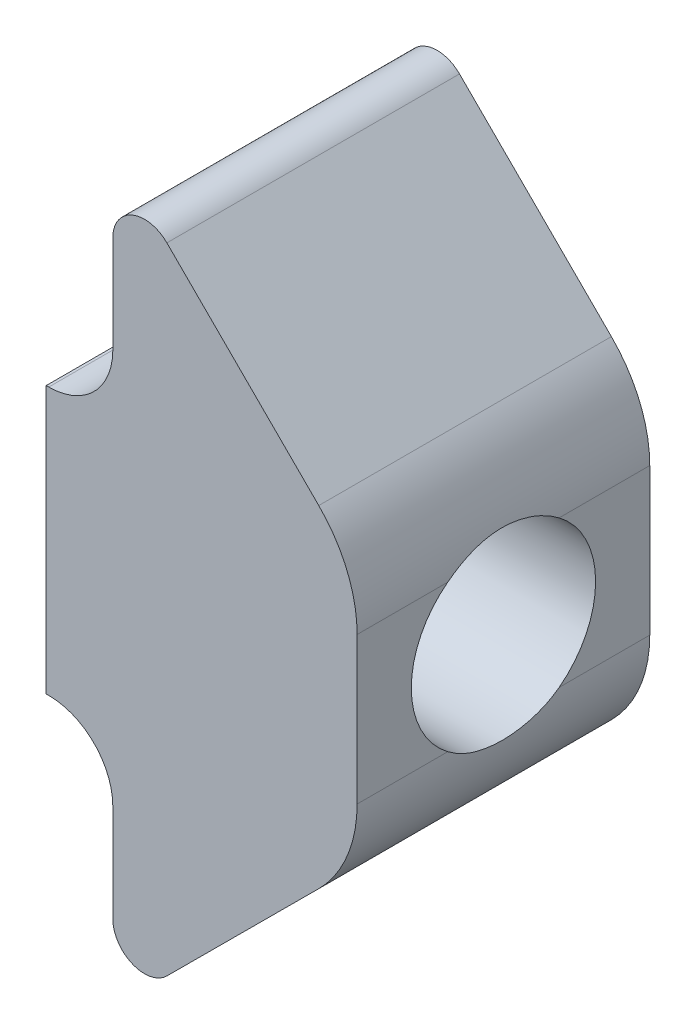
ISO-10303-21;
HEADER;
FILE_DESCRIPTION(('STEP AP214'),'2;1');
FILE_NAME('part.step','',(''),(''),'','','');
FILE_SCHEMA(('AUTOMOTIVE_DESIGN { 1 0 10303 214 1 1 1 1 }'));
ENDSEC;
DATA;
#1=APPLICATION_CONTEXT('core data for automotive mechanical design processes');
#2=APPLICATION_PROTOCOL_DEFINITION('international standard','automotive_design',2000,#1);
#3=PRODUCT_CONTEXT('',#1,'mechanical');
#4=PRODUCT('Part','Part','',(#3));
#5=PRODUCT_RELATED_PRODUCT_CATEGORY('part','',(#4));
#6=PRODUCT_DEFINITION_FORMATION('','',#4);
#7=PRODUCT_DEFINITION_CONTEXT('part definition',#1,'design');
#8=PRODUCT_DEFINITION('design','',#6,#7);
#9=PRODUCT_DEFINITION_SHAPE('','',#8);
#10=(LENGTH_UNIT() NAMED_UNIT(*) SI_UNIT(.MILLI.,.METRE.));
#11=(NAMED_UNIT(*) PLANE_ANGLE_UNIT() SI_UNIT($,.RADIAN.));
#12=(NAMED_UNIT(*) SI_UNIT($,.STERADIAN.) SOLID_ANGLE_UNIT());
#13=UNCERTAINTY_MEASURE_WITH_UNIT(LENGTH_MEASURE(1.E-05),#10,'distance_accuracy_value','');
#14=(GEOMETRIC_REPRESENTATION_CONTEXT(3) GLOBAL_UNCERTAINTY_ASSIGNED_CONTEXT((#13)) GLOBAL_UNIT_ASSIGNED_CONTEXT((#10,
#11,#12)) REPRESENTATION_CONTEXT('',''));
#15=CARTESIAN_POINT('',(0.,0.,0.));
#16=DIRECTION('',(0.,0.,1.));
#17=DIRECTION('',(1.,0.,0.));
#18=AXIS2_PLACEMENT_3D('',#15,#16,#17);
#19=CARTESIAN_POINT('',(-4.84850000000001,1.59318550686057,6.35));
#20=DIRECTION('',(1.,0.,0.));
#21=DIRECTION('',(0.,1.,0.));
#22=AXIS2_PLACEMENT_3D('',#19,#20,#21);
#23=PLANE('',#22);
#24=CARTESIAN_POINT('',(-4.84850000000001,0.,3.175));
#25=DIRECTION('',(1.,0.,0.));
#26=DIRECTION('',(0.,1.,0.));
#27=AXIS2_PLACEMENT_3D('',#24,#25,#26);
#28=CIRCLE('',#27,2.);
#29=CARTESIAN_POINT('',(-4.8485,-1.59318550686057,4.38403264667643));
#30=VERTEX_POINT('',#29);
#31=CARTESIAN_POINT('',(-4.84850000000002,1.59318550686057,4.38403264667644));
#32=VERTEX_POINT('',#31);
#33=EDGE_CURVE('E333',#30,#32,#28,.F.);
#34=ORIENTED_EDGE('',*,*,#33,.T.);
#35=DIRECTION('',(0.,0.,-1.));
#36=VECTOR('',#35,1.);
#37=CARTESIAN_POINT('',(-4.84850000000002,1.59318550686057,6.35));
#38=LINE('',#37,#36);
#39=CARTESIAN_POINT('',(-4.84850000000002,1.59318550686057,6.35));
#40=VERTEX_POINT('',#39);
#41=EDGE_CURVE('E266',#40,#32,#38,.T.);
#42=ORIENTED_EDGE('',*,*,#41,.F.);
#43=DIRECTION('',(0.,-1.,0.));
#44=VECTOR('',#43,1.);
#45=CARTESIAN_POINT('',(-4.84850000000001,1.59318550686057,6.35));
#46=LINE('',#45,#44);
#47=CARTESIAN_POINT('',(-4.8485,-1.59318550686057,6.35));
#48=VERTEX_POINT('',#47);
#49=EDGE_CURVE('E356',#40,#48,#46,.T.);
#50=ORIENTED_EDGE('',*,*,#49,.T.);
#51=DIRECTION('',(0.,0.,-1.));
#52=VECTOR('',#51,1.);
#53=CARTESIAN_POINT('',(-4.8485,-1.59318550686057,6.35));
#54=LINE('',#53,#52);
#55=EDGE_CURVE('E261',#48,#30,#54,.T.);
#56=ORIENTED_EDGE('',*,*,#55,.T.);
#57=EDGE_LOOP('',(#34,#42,#50,#56));
#58=FACE_BOUND('',#57,.T.);
#59=ADVANCED_FACE('F45',(#58),#23,.T.);
#60=CARTESIAN_POINT('',(-11.5392124071298,-2.89845688183043,6.35));
#61=DIRECTION('',(0.,-1.,0.));
#62=DIRECTION('',(1.,0.,0.));
#63=AXIS2_PLACEMENT_3D('',#60,#61,#62);
#64=PLANE('',#63);
#65=DIRECTION('',(-1.,0.,0.));
#66=VECTOR('',#65,1.);
#67=CARTESIAN_POINT('',(-11.5392124071298,-2.89845688183043,0.));
#68=LINE('',#67,#66);
#69=CARTESIAN_POINT('',(-11.5392124071298,-2.89845688183043,0.));
#70=VERTEX_POINT('',#69);
#71=CARTESIAN_POINT('',(-11.5951,-2.89845688183043,0.));
#72=VERTEX_POINT('',#71);
#73=EDGE_CURVE('E197',#70,#72,#68,.T.);
#74=ORIENTED_EDGE('',*,*,#73,.F.);
#75=DIRECTION('',(0.,0.,-1.));
#76=VECTOR('',#75,1.);
#77=CARTESIAN_POINT('',(-11.5392124071298,-2.89845688183043,6.35));
#78=LINE('',#77,#76);
#79=CARTESIAN_POINT('',(-11.5392124071298,-2.89845688183043,6.35));
#80=VERTEX_POINT('',#79);
#81=EDGE_CURVE('E71',#80,#70,#78,.T.);
#82=ORIENTED_EDGE('',*,*,#81,.F.);
#83=DIRECTION('',(-1.,0.,0.));
#84=VECTOR('',#83,1.);
#85=CARTESIAN_POINT('',(-11.5392124071298,-2.89845688183043,6.35));
#86=LINE('',#85,#84);
#87=CARTESIAN_POINT('',(-11.5951,-2.89845688183043,6.35));
#88=VERTEX_POINT('',#87);
#89=EDGE_CURVE('E251',#80,#88,#86,.T.);
#90=ORIENTED_EDGE('',*,*,#89,.T.);
#91=DIRECTION('',(0.,0.,-1.));
#92=VECTOR('',#91,1.);
#93=CARTESIAN_POINT('',(-11.5951,-2.89845688183043,6.35));
#94=LINE('',#93,#92);
#95=EDGE_CURVE('E128',#88,#72,#94,.T.);
#96=ORIENTED_EDGE('',*,*,#95,.T.);
#97=EDGE_LOOP('',(#74,#82,#90,#96));
#98=FACE_BOUND('',#97,.T.);
#99=ADVANCED_FACE('F305',(#98),#64,.T.);
#100=CARTESIAN_POINT('',(-11.5392124071298,-4.28746928896025,6.35));
#101=DIRECTION('',(0.,0.,-1.));
#102=DIRECTION('',(-1.,0.,0.));
#103=AXIS2_PLACEMENT_3D('',#100,#101,#102);
#104=CYLINDRICAL_SURFACE('',#103,1.38901240712982);
#105=CARTESIAN_POINT('',(-11.5392124071298,-4.28746928896025,0.));
#106=DIRECTION('',(0.,0.,1.));
#107=DIRECTION('',(1.,0.,0.));
#108=AXIS2_PLACEMENT_3D('',#105,#106,#107);
#109=CIRCLE('',#108,1.38901240712982);
#110=CARTESIAN_POINT('',(-10.1502,-4.28746928896025,0.));
#111=VERTEX_POINT('',#110);
#112=EDGE_CURVE('E247',#111,#70,#109,.T.);
#113=ORIENTED_EDGE('',*,*,#112,.F.);
#114=DIRECTION('',(0.,0.,-1.));
#115=VECTOR('',#114,1.);
#116=CARTESIAN_POINT('',(-10.1502,-4.28746928896025,6.35));
#117=LINE('',#116,#115);
#118=CARTESIAN_POINT('',(-10.1502,-4.28746928896025,6.35));
#119=VERTEX_POINT('',#118);
#120=EDGE_CURVE('E177',#119,#111,#117,.T.);
#121=ORIENTED_EDGE('',*,*,#120,.F.);
#122=CARTESIAN_POINT('',(-11.5392124071298,-4.28746928896025,6.35));
#123=DIRECTION('',(0.,0.,1.));
#124=DIRECTION('',(1.,0.,0.));
#125=AXIS2_PLACEMENT_3D('',#122,#123,#124);
#126=CIRCLE('',#125,1.38901240712982);
#127=EDGE_CURVE('E190',#119,#80,#126,.T.);
#128=ORIENTED_EDGE('',*,*,#127,.T.);
#129=ORIENTED_EDGE('',*,*,#81,.T.);
#130=EDGE_LOOP('',(#113,#121,#128,#129));
#131=FACE_BOUND('',#130,.T.);
#132=ADVANCED_FACE('F312',(#131),#104,.F.);
#133=CARTESIAN_POINT('',(-10.1502,-6.4020890233125,6.35));
#134=DIRECTION('',(-1.,0.,0.));
#135=DIRECTION('',(0.,0.,1.));
#136=AXIS2_PLACEMENT_3D('',#133,#134,#135);
#137=PLANE('',#136);
#138=DIRECTION('',(0.,1.,0.));
#139=VECTOR('',#138,1.);
#140=CARTESIAN_POINT('',(-10.1502,-6.4020890233125,0.));
#141=LINE('',#140,#139);
#142=CARTESIAN_POINT('',(-10.1502,-6.4020890233125,0.));
#143=VERTEX_POINT('',#142);
#144=EDGE_CURVE('E172',#143,#111,#141,.T.);
#145=ORIENTED_EDGE('',*,*,#144,.F.);
#146=DIRECTION('',(0.,0.,-1.));
#147=VECTOR('',#146,1.);
#148=CARTESIAN_POINT('',(-10.1502,-6.4020890233125,6.35));
#149=LINE('',#148,#147);
#150=CARTESIAN_POINT('',(-10.1502,-6.4020890233125,6.35));
#151=VERTEX_POINT('',#150);
#152=EDGE_CURVE('E165',#151,#143,#149,.T.);
#153=ORIENTED_EDGE('',*,*,#152,.F.);
#154=DIRECTION('',(0.,1.,0.));
#155=VECTOR('',#154,1.);
#156=CARTESIAN_POINT('',(-10.1502,-6.4020890233125,6.35));
#157=LINE('',#156,#155);
#158=EDGE_CURVE('E169',#151,#119,#157,.T.);
#159=ORIENTED_EDGE('',*,*,#158,.T.);
#160=ORIENTED_EDGE('',*,*,#120,.T.);
#161=EDGE_LOOP('',(#145,#153,#159,#160));
#162=FACE_BOUND('',#161,.T.);
#163=ADVANCED_FACE('F167',(#162),#137,.T.);
#164=CARTESIAN_POINT('',(-9.4627890233125,-6.4020890233125,6.35));
#165=DIRECTION('',(0.,0.,-1.));
#166=DIRECTION('',(-1.,0.,0.));
#167=AXIS2_PLACEMENT_3D('',#164,#165,#166);
#168=CYLINDRICAL_SURFACE('',#167,0.687410976687497);
#169=CARTESIAN_POINT('',(-9.4627890233125,-6.4020890233125,0.));
#170=DIRECTION('',(0.,0.,1.));
#171=DIRECTION('',(1.,0.,0.));
#172=AXIS2_PLACEMENT_3D('',#169,#170,#171);
#173=CIRCLE('',#172,0.687410976687497);
#174=CARTESIAN_POINT('',(-8.97727245466201,-6.8887177446559,0.));
#175=VERTEX_POINT('',#174);
#176=EDGE_CURVE('E242',#143,#175,#173,.T.);
#177=ORIENTED_EDGE('',*,*,#176,.T.);
#178=DIRECTION('',(0.,0.,-1.));
#179=VECTOR('',#178,1.);
#180=CARTESIAN_POINT('',(-8.97727245466201,-6.8887177446559,6.35));
#181=LINE('',#180,#179);
#182=CARTESIAN_POINT('',(-8.97727245466201,-6.8887177446559,6.35));
#183=VERTEX_POINT('',#182);
#184=EDGE_CURVE('E178',#183,#175,#181,.T.);
#185=ORIENTED_EDGE('',*,*,#184,.F.);
#186=CARTESIAN_POINT('',(-9.4627890233125,-6.4020890233125,6.35));
#187=DIRECTION('',(0.,0.,1.));
#188=DIRECTION('',(1.,0.,0.));
#189=AXIS2_PLACEMENT_3D('',#186,#187,#188);
#190=CIRCLE('',#189,0.687410976687497);
#191=EDGE_CURVE('E181',#151,#183,#190,.T.);
#192=ORIENTED_EDGE('',*,*,#191,.F.);
#193=ORIENTED_EDGE('',*,*,#152,.T.);
#194=EDGE_LOOP('',(#177,#185,#192,#193));
#195=FACE_BOUND('',#194,.T.);
#196=ADVANCED_FACE('F182',(#195),#168,.T.);
#197=CARTESIAN_POINT('',(-5.68114694076178,-3.60012527331083,6.35));
#198=DIRECTION('',(0.706297375392672,-0.707915261534474,0.));
#199=DIRECTION('',(0.707915261534474,0.706297375392672,0.));
#200=AXIS2_PLACEMENT_3D('',#197,#198,#199);
#201=PLANE('',#200);
#202=DIRECTION('',(-0.707915261534474,-0.706297375392672,0.));
#203=VECTOR('',#202,1.);
#204=CARTESIAN_POINT('',(-5.68114694076178,-3.60012527331083,0.));
#205=LINE('',#204,#203);
#206=CARTESIAN_POINT('',(-5.68114694076178,-3.60012527331083,0.));
#207=VERTEX_POINT('',#206);
#208=EDGE_CURVE('E238',#207,#175,#205,.T.);
#209=ORIENTED_EDGE('',*,*,#208,.F.);
#210=DIRECTION('',(0.,0.,-1.));
#211=VECTOR('',#210,1.);
#212=CARTESIAN_POINT('',(-5.68114694076178,-3.60012527331083,6.35));
#213=LINE('',#212,#211);
#214=CARTESIAN_POINT('',(-5.68114694076178,-3.60012527331083,6.35));
#215=VERTEX_POINT('',#214);
#216=EDGE_CURVE('E258',#215,#207,#213,.T.);
#217=ORIENTED_EDGE('',*,*,#216,.F.);
#218=DIRECTION('',(-0.707915261534474,-0.706297375392672,0.));
#219=VECTOR('',#218,1.);
#220=CARTESIAN_POINT('',(-5.68114694076178,-3.60012527331083,6.35));
#221=LINE('',#220,#219);
#222=EDGE_CURVE('E187',#215,#183,#221,.T.);
#223=ORIENTED_EDGE('',*,*,#222,.T.);
#224=ORIENTED_EDGE('',*,*,#184,.T.);
#225=EDGE_LOOP('',(#209,#217,#223,#224));
#226=FACE_BOUND('',#225,.T.);
#227=ADVANCED_FACE('F326',(#226),#201,.T.);
#228=CARTESIAN_POINT('',(-7.68350000000002,-1.59318550686057,6.35));
#229=DIRECTION('',(0.,0.,-1.));
#230=DIRECTION('',(-1.,0.,0.));
#231=AXIS2_PLACEMENT_3D('',#228,#229,#230);
#232=CYLINDRICAL_SURFACE('',#231,2.83500000000002);
#233=CARTESIAN_POINT('',(-4.8485,-1.59318550686057,1.96596735332357));
#234=VERTEX_POINT('',#233);
#235=CARTESIAN_POINT('',(-4.8485,-1.59318550686057,0.));
#236=VERTEX_POINT('',#235);
#237=EDGE_CURVE('E265',#234,#236,#54,.T.);
#238=ORIENTED_EDGE('',*,*,#237,.F.);
#239=CARTESIAN_POINT('',(-4.8485,-1.59318550686057,4.38403264667643));
#240=CARTESIAN_POINT('',(-4.84850308561029,-1.62712484855175,4.3393095314669));
#241=CARTESIAN_POINT('',(-4.84910882888475,-1.6591597204346,4.29318329005491));
#242=CARTESIAN_POINT('',(-4.85114353516568,-1.71923013061945,4.19842405337767));
#243=CARTESIAN_POINT('',(-4.8525723503233,-1.74726638606702,4.14979150974908));
#244=CARTESIAN_POINT('',(-4.8575177688708,-1.82505986665809,4.00065286751083));
#245=CARTESIAN_POINT('',(-4.86169479925717,-1.86856681059163,3.89681990328879));
#246=CARTESIAN_POINT('',(-4.86927948615166,-1.93757363458942,3.68334062184577));
#247=CARTESIAN_POINT('',(-4.87268700422418,-1.96307027634548,3.57369326298691));
#248=CARTESIAN_POINT('',(-4.87711909041569,-1.99533222788243,3.35167586400853));
#249=CARTESIAN_POINT('',(-4.8781451563532,-2.00210931187256,3.23930758018668));
#250=CARTESIAN_POINT('',(-4.87737080240947,-1.99675592918241,3.01541964824647));
#251=CARTESIAN_POINT('',(-4.87557990931483,-1.98468919216611,2.90389841595686));
#252=CARTESIAN_POINT('',(-4.86997512405689,-1.94212525852656,2.68444006291147));
#253=CARTESIAN_POINT('',(-4.86616040922986,-1.91162056635213,2.57650441863488));
#254=CARTESIAN_POINT('',(-4.85891625335289,-1.83834132722586,2.38137016881734));
#255=CARTESIAN_POINT('',(-4.85550426572148,-1.79777731951542,2.29333843704545));
#256=CARTESIAN_POINT('',(-4.85159971049736,-1.72775474162388,2.16643627336427));
#257=CARTESIAN_POINT('',(-4.85050051297078,-1.70288942448781,2.12499968318224));
#258=CARTESIAN_POINT('',(-4.84895150831775,-1.65021463653707,2.04401587031247));
#259=CARTESIAN_POINT('',(-4.84850185745839,-1.62240445897834,2.0044691044881));
#260=CARTESIAN_POINT('',(-4.8485,-1.59318550686057,1.96596735332357));
#261=B_SPLINE_CURVE_WITH_KNOTS('',3,(#239,#240,#241,#242,#243,#244,#245,#246,#247,#248,#249,
#250,#251,#252,#253,#254,#255,#256,#257,#258,#259,#260),.UNSPECIFIED.,.F.,.F.,(4,2,2,2,2,2,2,2,
2,2,4),(0.,0.168313388779628,0.336596552755251,0.67284393963858,1.00915176946611,
1.34524802050167,1.68021005581813,2.01530835436466,2.30519844116591,2.45009458928721,
2.59502559053129),.UNSPECIFIED.);
#262=EDGE_CURVE('E202',#30,#234,#261,.T.);
#263=ORIENTED_EDGE('',*,*,#262,.F.);
#264=ORIENTED_EDGE('',*,*,#55,.F.);
#265=CARTESIAN_POINT('',(-7.68350000000002,-1.59318550686057,6.35));
#266=DIRECTION('',(0.,0.,1.));
#267=DIRECTION('',(1.,0.,0.));
#268=AXIS2_PLACEMENT_3D('',#265,#266,#267);
#269=CIRCLE('',#268,2.83500000000002);
#270=EDGE_CURVE('E360',#215,#48,#269,.T.);
#271=ORIENTED_EDGE('',*,*,#270,.F.);
#272=ORIENTED_EDGE('',*,*,#216,.T.);
#273=CARTESIAN_POINT('',(-7.68350000000002,-1.59318550686057,0.));
#274=DIRECTION('',(0.,0.,1.));
#275=DIRECTION('',(1.,0.,0.));
#276=AXIS2_PLACEMENT_3D('',#273,#274,#275);
#277=CIRCLE('',#276,2.83500000000002);
#278=EDGE_CURVE('E234',#207,#236,#277,.T.);
#279=ORIENTED_EDGE('',*,*,#278,.T.);
#280=EDGE_LOOP('',(#238,#263,#264,#271,#272,#279));
#281=FACE_BOUND('',#280,.T.);
#282=ADVANCED_FACE('F318',(#281),#232,.T.);
#283=CARTESIAN_POINT('',(-4.84850000000002,1.59318550686057,1.96596735332358));
#284=VERTEX_POINT('',#283);
#285=EDGE_CURVE('E62',#284,#234,#28,.F.);
#286=ORIENTED_EDGE('',*,*,#285,.T.);
#287=ORIENTED_EDGE('',*,*,#237,.T.);
#288=DIRECTION('',(0.,-1.,0.));
#289=VECTOR('',#288,1.);
#290=CARTESIAN_POINT('',(-4.84850000000001,1.59318550686057,0.));
#291=LINE('',#290,#289);
#292=CARTESIAN_POINT('',(-4.84850000000002,1.59318550686057,0.));
#293=VERTEX_POINT('',#292);
#294=EDGE_CURVE('E230',#293,#236,#291,.T.);
#295=ORIENTED_EDGE('',*,*,#294,.F.);
#296=EDGE_CURVE('E270',#284,#293,#38,.T.);
#297=ORIENTED_EDGE('',*,*,#296,.F.);
#298=EDGE_LOOP('',(#286,#287,#295,#297));
#299=FACE_BOUND('',#298,.T.);
#300=ADVANCED_FACE('F308',(#299),#23,.T.);
#301=CARTESIAN_POINT('',(-7.68350000000002,1.59318550686057,6.35));
#302=DIRECTION('',(0.,0.,-1.));
#303=DIRECTION('',(-1.,0.,0.));
#304=AXIS2_PLACEMENT_3D('',#301,#302,#303);
#305=CYLINDRICAL_SURFACE('',#304,2.83500000000001);
#306=ORIENTED_EDGE('',*,*,#41,.T.);
#307=CARTESIAN_POINT('',(-4.84850000000002,1.59318550686057,1.96596735332357));
#308=CARTESIAN_POINT('',(-4.84850308561031,1.62712484855175,2.0106904685331));
#309=CARTESIAN_POINT('',(-4.84910882888477,1.6591597204346,2.05681670994509));
#310=CARTESIAN_POINT('',(-4.8511435351657,1.71923013061945,2.15157594662234));
#311=CARTESIAN_POINT('',(-4.85257235032332,1.74726638606702,2.20020849025092));
#312=CARTESIAN_POINT('',(-4.85751776887082,1.82505986665809,2.34934713248917));
#313=CARTESIAN_POINT('',(-4.86169479925719,1.86856681059163,2.45318009671121));
#314=CARTESIAN_POINT('',(-4.86927948615168,1.93757363458942,2.66665937815423));
#315=CARTESIAN_POINT('',(-4.8726870042242,1.96307027634549,2.77630673701309));
#316=CARTESIAN_POINT('',(-4.87711909041571,1.99533222788243,2.99832413599147));
#317=CARTESIAN_POINT('',(-4.87814515635322,2.00210931187256,3.11069241981332));
#318=CARTESIAN_POINT('',(-4.87737080240948,1.99675592918241,3.33458035175354));
#319=CARTESIAN_POINT('',(-4.87557990931485,1.98468919216611,3.44610158404314));
#320=CARTESIAN_POINT('',(-4.86997512405691,1.94212525852656,3.66555993708853));
#321=CARTESIAN_POINT('',(-4.86616040922988,1.91162056635214,3.77349558136513));
#322=CARTESIAN_POINT('',(-4.85891625335291,1.83834132722586,3.96862983118266));
#323=CARTESIAN_POINT('',(-4.85550426572149,1.79777731951542,4.05666156295455));
#324=CARTESIAN_POINT('',(-4.85159971049737,1.72775474162388,4.18356372663573));
#325=CARTESIAN_POINT('',(-4.85050051297079,1.70288942448781,4.22500031681777));
#326=CARTESIAN_POINT('',(-4.84895150831777,1.65021463653707,4.30598412968753));
#327=CARTESIAN_POINT('',(-4.84850185745841,1.62240445897834,4.3455308955119));
#328=CARTESIAN_POINT('',(-4.84850000000002,1.59318550686057,4.38403264667643));
#329=B_SPLINE_CURVE_WITH_KNOTS('',3,(#307,#308,#309,#310,#311,#312,#313,#314,#315,#316,#317,
#318,#319,#320,#321,#322,#323,#324,#325,#326,#327,#328),.UNSPECIFIED.,.F.,.F.,(4,2,2,2,2,2,2,2,
2,2,4),(0.,0.168313388779629,0.336596552755252,0.67284393963858,1.00915176946611,
1.34524802050167,1.68021005581813,2.01530835436466,2.30519844116591,2.45009458928721,
2.59502559053129),.UNSPECIFIED.);
#330=EDGE_CURVE('E342',#284,#32,#329,.T.);
#331=ORIENTED_EDGE('',*,*,#330,.F.);
#332=ORIENTED_EDGE('',*,*,#296,.T.);
#333=CARTESIAN_POINT('',(-7.68350000000002,1.59318550686057,0.));
#334=DIRECTION('',(0.,0.,1.));
#335=DIRECTION('',(1.,0.,0.));
#336=AXIS2_PLACEMENT_3D('',#333,#334,#335);
#337=CIRCLE('',#336,2.83500000000001);
#338=CARTESIAN_POINT('',(-5.68114694076179,3.6001252733108,0.));
#339=VERTEX_POINT('',#338);
#340=EDGE_CURVE('E226',#293,#339,#337,.T.);
#341=ORIENTED_EDGE('',*,*,#340,.T.);
#342=DIRECTION('',(0.,0.,-1.));
#343=VECTOR('',#342,1.);
#344=CARTESIAN_POINT('',(-5.68114694076179,3.6001252733108,6.35));
#345=LINE('',#344,#343);
#346=CARTESIAN_POINT('',(-5.68114694076179,3.6001252733108,6.35));
#347=VERTEX_POINT('',#346);
#348=EDGE_CURVE('E271',#347,#339,#345,.T.);
#349=ORIENTED_EDGE('',*,*,#348,.F.);
#350=CARTESIAN_POINT('',(-7.68350000000002,1.59318550686057,6.35));
#351=DIRECTION('',(0.,0.,1.));
#352=DIRECTION('',(1.,0.,0.));
#353=AXIS2_PLACEMENT_3D('',#350,#351,#352);
#354=CIRCLE('',#353,2.83500000000001);
#355=EDGE_CURVE('E352',#40,#347,#354,.T.);
#356=ORIENTED_EDGE('',*,*,#355,.F.);
#357=EDGE_LOOP('',(#306,#331,#332,#341,#349,#356));
#358=FACE_BOUND('',#357,.T.);
#359=ADVANCED_FACE('F317',(#358),#305,.T.);
#360=CARTESIAN_POINT('',(-8.97727245466201,6.8887177446559,6.35));
#361=DIRECTION('',(0.706297375392675,0.707915261534471,0.));
#362=DIRECTION('',(-0.707915261534471,0.706297375392675,0.));
#363=AXIS2_PLACEMENT_3D('',#360,#361,#362);
#364=PLANE('',#363);
#365=DIRECTION('',(0.707915261534471,-0.706297375392675,0.));
#366=VECTOR('',#365,1.);
#367=CARTESIAN_POINT('',(-8.97727245466201,6.8887177446559,0.));
#368=LINE('',#367,#366);
#369=CARTESIAN_POINT('',(-8.97727245466201,6.8887177446559,0.));
#370=VERTEX_POINT('',#369);
#371=EDGE_CURVE('E222',#370,#339,#368,.T.);
#372=ORIENTED_EDGE('',*,*,#371,.F.);
#373=DIRECTION('',(0.,0.,-1.));
#374=VECTOR('',#373,1.);
#375=CARTESIAN_POINT('',(-8.97727245466201,6.8887177446559,6.35));
#376=LINE('',#375,#374);
#377=CARTESIAN_POINT('',(-8.97727245466201,6.8887177446559,6.35));
#378=VERTEX_POINT('',#377);
#379=EDGE_CURVE('E274',#378,#370,#376,.T.);
#380=ORIENTED_EDGE('',*,*,#379,.F.);
#381=DIRECTION('',(0.707915261534471,-0.706297375392675,0.));
#382=VECTOR('',#381,1.);
#383=CARTESIAN_POINT('',(-8.97727245466201,6.8887177446559,6.35));
#384=LINE('',#383,#382);
#385=EDGE_CURVE('E350',#378,#347,#384,.T.);
#386=ORIENTED_EDGE('',*,*,#385,.T.);
#387=ORIENTED_EDGE('',*,*,#348,.T.);
#388=EDGE_LOOP('',(#372,#380,#386,#387));
#389=FACE_BOUND('',#388,.T.);
#390=ADVANCED_FACE('F324',(#389),#364,.T.);
#391=CARTESIAN_POINT('',(-9.4627890233125,6.4020890233125,6.35));
#392=DIRECTION('',(0.,0.,-1.));
#393=DIRECTION('',(-1.,0.,0.));
#394=AXIS2_PLACEMENT_3D('',#391,#392,#393);
#395=CYLINDRICAL_SURFACE('',#394,0.687410976687497);
#396=CARTESIAN_POINT('',(-9.4627890233125,6.4020890233125,0.));
#397=DIRECTION('',(0.,0.,1.));
#398=DIRECTION('',(1.,0.,0.));
#399=AXIS2_PLACEMENT_3D('',#396,#397,#398);
#400=CIRCLE('',#399,0.687410976687497);
#401=CARTESIAN_POINT('',(-10.1502,6.4020890233125,0.));
#402=VERTEX_POINT('',#401);
#403=EDGE_CURVE('E218',#370,#402,#400,.T.);
#404=ORIENTED_EDGE('',*,*,#403,.T.);
#405=DIRECTION('',(0.,0.,-1.));
#406=VECTOR('',#405,1.);
#407=CARTESIAN_POINT('',(-10.1502,6.4020890233125,6.35));
#408=LINE('',#407,#406);
#409=CARTESIAN_POINT('',(-10.1502,6.4020890233125,6.35));
#410=VERTEX_POINT('',#409);
#411=EDGE_CURVE('E277',#410,#402,#408,.T.);
#412=ORIENTED_EDGE('',*,*,#411,.F.);
#413=CARTESIAN_POINT('',(-9.4627890233125,6.4020890233125,6.35));
#414=DIRECTION('',(0.,0.,1.));
#415=DIRECTION('',(1.,0.,0.));
#416=AXIS2_PLACEMENT_3D('',#413,#414,#415);
#417=CIRCLE('',#416,0.687410976687497);
#418=EDGE_CURVE('E408',#378,#410,#417,.T.);
#419=ORIENTED_EDGE('',*,*,#418,.F.);
#420=ORIENTED_EDGE('',*,*,#379,.T.);
#421=EDGE_LOOP('',(#404,#412,#419,#420));
#422=FACE_BOUND('',#421,.T.);
#423=ADVANCED_FACE('F415',(#422),#395,.T.);
#424=CARTESIAN_POINT('',(-10.1502,4.28746928896025,6.35));
#425=DIRECTION('',(-1.,0.,0.));
#426=DIRECTION('',(0.,0.,1.));
#427=AXIS2_PLACEMENT_3D('',#424,#425,#426);
#428=PLANE('',#427);
#429=DIRECTION('',(0.,1.,0.));
#430=VECTOR('',#429,1.);
#431=CARTESIAN_POINT('',(-10.1502,4.28746928896025,0.));
#432=LINE('',#431,#430);
#433=CARTESIAN_POINT('',(-10.1502,4.28746928896025,0.));
#434=VERTEX_POINT('',#433);
#435=EDGE_CURVE('E214',#434,#402,#432,.T.);
#436=ORIENTED_EDGE('',*,*,#435,.F.);
#437=DIRECTION('',(0.,0.,-1.));
#438=VECTOR('',#437,1.);
#439=CARTESIAN_POINT('',(-10.1502,4.28746928896025,6.35));
#440=LINE('',#439,#438);
#441=CARTESIAN_POINT('',(-10.1502,4.28746928896025,6.35));
#442=VERTEX_POINT('',#441);
#443=EDGE_CURVE('E280',#442,#434,#440,.T.);
#444=ORIENTED_EDGE('',*,*,#443,.F.);
#445=DIRECTION('',(0.,1.,0.));
#446=VECTOR('',#445,1.);
#447=CARTESIAN_POINT('',(-10.1502,4.28746928896025,6.35));
#448=LINE('',#447,#446);
#449=EDGE_CURVE('E404',#442,#410,#448,.T.);
#450=ORIENTED_EDGE('',*,*,#449,.T.);
#451=ORIENTED_EDGE('',*,*,#411,.T.);
#452=EDGE_LOOP('',(#436,#444,#450,#451));
#453=FACE_BOUND('',#452,.T.);
#454=ADVANCED_FACE('F418',(#453),#428,.T.);
#455=CARTESIAN_POINT('',(-11.5392124071298,4.28746928896025,6.35));
#456=DIRECTION('',(0.,0.,-1.));
#457=DIRECTION('',(-1.,0.,0.));
#458=AXIS2_PLACEMENT_3D('',#455,#456,#457);
#459=CYLINDRICAL_SURFACE('',#458,1.38901240712982);
#460=CARTESIAN_POINT('',(-11.5392124071298,4.28746928896025,0.));
#461=DIRECTION('',(0.,0.,1.));
#462=DIRECTION('',(1.,0.,0.));
#463=AXIS2_PLACEMENT_3D('',#460,#461,#462);
#464=CIRCLE('',#463,1.38901240712982);
#465=CARTESIAN_POINT('',(-11.5392124071298,2.89845688183043,0.));
#466=VERTEX_POINT('',#465);
#467=EDGE_CURVE('E210',#466,#434,#464,.T.);
#468=ORIENTED_EDGE('',*,*,#467,.F.);
#469=DIRECTION('',(0.,0.,-1.));
#470=VECTOR('',#469,1.);
#471=CARTESIAN_POINT('',(-11.5392124071298,2.89845688183043,6.35));
#472=LINE('',#471,#470);
#473=CARTESIAN_POINT('',(-11.5392124071298,2.89845688183043,6.35));
#474=VERTEX_POINT('',#473);
#475=EDGE_CURVE('E283',#474,#466,#472,.T.);
#476=ORIENTED_EDGE('',*,*,#475,.F.);
#477=CARTESIAN_POINT('',(-11.5392124071298,4.28746928896025,6.35));
#478=DIRECTION('',(0.,0.,1.));
#479=DIRECTION('',(1.,0.,0.));
#480=AXIS2_PLACEMENT_3D('',#477,#478,#479);
#481=CIRCLE('',#480,1.38901240712982);
#482=EDGE_CURVE('E400',#474,#442,#481,.T.);
#483=ORIENTED_EDGE('',*,*,#482,.T.);
#484=ORIENTED_EDGE('',*,*,#443,.T.);
#485=EDGE_LOOP('',(#468,#476,#483,#484));
#486=FACE_BOUND('',#485,.T.);
#487=ADVANCED_FACE('F421',(#486),#459,.F.);
#488=CARTESIAN_POINT('',(-11.5951,2.89845688183043,6.35));
#489=DIRECTION('',(0.,1.,0.));
#490=DIRECTION('',(0.,0.,1.));
#491=AXIS2_PLACEMENT_3D('',#488,#489,#490);
#492=PLANE('',#491);
#493=DIRECTION('',(1.,0.,0.));
#494=VECTOR('',#493,1.);
#495=CARTESIAN_POINT('',(-11.5951,2.89845688183043,0.));
#496=LINE('',#495,#494);
#497=CARTESIAN_POINT('',(-11.5951,2.89845688183043,0.));
#498=VERTEX_POINT('',#497);
#499=EDGE_CURVE('E206',#498,#466,#496,.T.);
#500=ORIENTED_EDGE('',*,*,#499,.F.);
#501=DIRECTION('',(0.,0.,-1.));
#502=VECTOR('',#501,1.);
#503=CARTESIAN_POINT('',(-11.5951,2.89845688183043,6.35));
#504=LINE('',#503,#502);
#505=CARTESIAN_POINT('',(-11.5951,2.89845688183043,6.35));
#506=VERTEX_POINT('',#505);
#507=EDGE_CURVE('E286',#506,#498,#504,.T.);
#508=ORIENTED_EDGE('',*,*,#507,.F.);
#509=DIRECTION('',(1.,0.,0.));
#510=VECTOR('',#509,1.);
#511=CARTESIAN_POINT('',(-11.5951,2.89845688183043,6.35));
#512=LINE('',#511,#510);
#513=EDGE_CURVE('E396',#506,#474,#512,.T.);
#514=ORIENTED_EDGE('',*,*,#513,.T.);
#515=ORIENTED_EDGE('',*,*,#475,.T.);
#516=EDGE_LOOP('',(#500,#508,#514,#515));
#517=FACE_BOUND('',#516,.T.);
#518=ADVANCED_FACE('F425',(#517),#492,.T.);
#519=CARTESIAN_POINT('',(-11.5951,-2.89845688183043,6.35));
#520=DIRECTION('',(-1.,0.,0.));
#521=DIRECTION('',(0.,0.,1.));
#522=AXIS2_PLACEMENT_3D('',#519,#520,#521);
#523=PLANE('',#522);
#524=CARTESIAN_POINT('',(-11.5951,0.,3.175));
#525=DIRECTION('',(-1.,0.,0.));
#526=DIRECTION('',(0.,0.,1.));
#527=AXIS2_PLACEMENT_3D('',#524,#525,#526);
#528=CIRCLE('',#527,2.4);
#529=CARTESIAN_POINT('',(-11.5951,0.,5.575));
#530=VERTEX_POINT('',#529);
#531=EDGE_CURVE('E13',#530,#530,#528,.F.);
#532=ORIENTED_EDGE('',*,*,#531,.T.);
#533=EDGE_LOOP('',(#532));
#534=FACE_BOUND('',#533,.T.);
#535=DIRECTION('',(0.,1.,0.));
#536=VECTOR('',#535,1.);
#537=CARTESIAN_POINT('',(-11.5951,-2.89845688183043,0.));
#538=LINE('',#537,#536);
#539=EDGE_CURVE('E201',#72,#498,#538,.T.);
#540=ORIENTED_EDGE('',*,*,#539,.F.);
#541=ORIENTED_EDGE('',*,*,#95,.F.);
#542=DIRECTION('',(0.,1.,0.));
#543=VECTOR('',#542,1.);
#544=CARTESIAN_POINT('',(-11.5951,-2.89845688183043,6.35));
#545=LINE('',#544,#543);
#546=EDGE_CURVE('E393',#88,#506,#545,.T.);
#547=ORIENTED_EDGE('',*,*,#546,.T.);
#548=ORIENTED_EDGE('',*,*,#507,.T.);
#549=EDGE_LOOP('',(#540,#541,#547,#548));
#550=FACE_BOUND('',#549,.T.);
#551=ADVANCED_FACE('F426',(#534,#550),#523,.T.);
#552=CARTESIAN_POINT('',(-11.5392124071298,4.28746928896025,6.35));
#553=DIRECTION('',(0.,0.,1.));
#554=DIRECTION('',(1.,0.,0.));
#555=AXIS2_PLACEMENT_3D('',#552,#553,#554);
#556=PLANE('',#555);
#557=ORIENTED_EDGE('',*,*,#89,.F.);
#558=ORIENTED_EDGE('',*,*,#127,.F.);
#559=ORIENTED_EDGE('',*,*,#158,.F.);
#560=ORIENTED_EDGE('',*,*,#191,.T.);
#561=ORIENTED_EDGE('',*,*,#222,.F.);
#562=ORIENTED_EDGE('',*,*,#270,.T.);
#563=ORIENTED_EDGE('',*,*,#49,.F.);
#564=ORIENTED_EDGE('',*,*,#355,.T.);
#565=ORIENTED_EDGE('',*,*,#385,.F.);
#566=ORIENTED_EDGE('',*,*,#418,.T.);
#567=ORIENTED_EDGE('',*,*,#449,.F.);
#568=ORIENTED_EDGE('',*,*,#482,.F.);
#569=ORIENTED_EDGE('',*,*,#513,.F.);
#570=ORIENTED_EDGE('',*,*,#546,.F.);
#571=EDGE_LOOP('',(#557,#558,#559,#560,#561,#562,#563,#564,#565,#566,#567,#568,#569,#570));
#572=FACE_BOUND('',#571,.T.);
#573=ADVANCED_FACE('F189',(#572),#556,.T.);
#574=CARTESIAN_POINT('',(-11.5392124071298,4.28746928896025,0.));
#575=DIRECTION('',(0.,0.,1.));
#576=DIRECTION('',(1.,0.,0.));
#577=AXIS2_PLACEMENT_3D('',#574,#575,#576);
#578=PLANE('',#577);
#579=ORIENTED_EDGE('',*,*,#73,.T.);
#580=ORIENTED_EDGE('',*,*,#539,.T.);
#581=ORIENTED_EDGE('',*,*,#499,.T.);
#582=ORIENTED_EDGE('',*,*,#467,.T.);
#583=ORIENTED_EDGE('',*,*,#435,.T.);
#584=ORIENTED_EDGE('',*,*,#403,.F.);
#585=ORIENTED_EDGE('',*,*,#371,.T.);
#586=ORIENTED_EDGE('',*,*,#340,.F.);
#587=ORIENTED_EDGE('',*,*,#294,.T.);
#588=ORIENTED_EDGE('',*,*,#278,.F.);
#589=ORIENTED_EDGE('',*,*,#208,.T.);
#590=ORIENTED_EDGE('',*,*,#176,.F.);
#591=ORIENTED_EDGE('',*,*,#144,.T.);
#592=ORIENTED_EDGE('',*,*,#112,.T.);
#593=EDGE_LOOP('',(#579,#580,#581,#582,#583,#584,#585,#586,#587,#588,#589,#590,#591,#592));
#594=FACE_BOUND('',#593,.T.);
#595=ADVANCED_FACE('F301',(#594),#578,.F.);
#596=CARTESIAN_POINT('',(-4.8475,0.,3.175));
#597=DIRECTION('',(-1.,0.,0.));
#598=DIRECTION('',(0.,0.,1.));
#599=AXIS2_PLACEMENT_3D('',#596,#597,#598);
#600=CYLINDRICAL_SURFACE('',#599,2.);
#601=CARTESIAN_POINT('',(-11.1951,0.,3.175));
#602=DIRECTION('',(-1.,0.,0.));
#603=DIRECTION('',(0.,0.,1.));
#604=AXIS2_PLACEMENT_3D('',#601,#602,#603);
#605=CIRCLE('',#604,2.);
#606=CARTESIAN_POINT('',(-11.1951,0.,5.175));
#607=VERTEX_POINT('',#606);
#608=EDGE_CURVE('E55',#607,#607,#605,.T.);
#609=ORIENTED_EDGE('',*,*,#608,.T.);
#610=EDGE_LOOP('',(#609));
#611=FACE_BOUND('',#610,.T.);
#612=ORIENTED_EDGE('',*,*,#262,.T.);
#613=ORIENTED_EDGE('',*,*,#285,.F.);
#614=ORIENTED_EDGE('',*,*,#330,.T.);
#615=ORIENTED_EDGE('',*,*,#33,.F.);
#616=EDGE_LOOP('',(#612,#613,#614,#615));
#617=FACE_BOUND('',#616,.T.);
#618=ADVANCED_FACE('F294',(#611,#617),#600,.F.);
#619=CARTESIAN_POINT('',(-11.1951,0.,3.175));
#620=DIRECTION('',(-1.,0.,0.));
#621=DIRECTION('',(0.,0.,1.));
#622=AXIS2_PLACEMENT_3D('',#619,#620,#621);
#623=CONICAL_SURFACE('',#622,2.,0.785398163397449);
#624=CARTESIAN_POINT('',(-11.5951,0.,5.575));
#625=CARTESIAN_POINT('',(-11.5909333333333,0.,5.57083333333333));
#626=CARTESIAN_POINT('',(-11.5867666666667,0.,5.56666666666667));
#627=CARTESIAN_POINT('',(-11.5784333333333,0.,5.55833333333333));
#628=CARTESIAN_POINT('',(-11.5742666666667,0.,5.55416666666667));
#629=CARTESIAN_POINT('',(-11.5659333333333,0.,5.54583333333333));
#630=CARTESIAN_POINT('',(-11.5617666666667,0.,5.54166666666667));
#631=CARTESIAN_POINT('',(-11.5534333333333,0.,5.53333333333333));
#632=CARTESIAN_POINT('',(-11.5492666666667,0.,5.52916666666667));
#633=CARTESIAN_POINT('',(-11.5409333333333,0.,5.52083333333333));
#634=CARTESIAN_POINT('',(-11.5367666666667,0.,5.51666666666667));
#635=CARTESIAN_POINT('',(-11.5284333333333,0.,5.50833333333333));
#636=CARTESIAN_POINT('',(-11.5242666666667,0.,5.50416666666667));
#637=CARTESIAN_POINT('',(-11.5159333333333,0.,5.49583333333333));
#638=CARTESIAN_POINT('',(-11.5117666666667,0.,5.49166666666667));
#639=CARTESIAN_POINT('',(-11.5034333333333,0.,5.48333333333333));
#640=CARTESIAN_POINT('',(-11.4992666666667,0.,5.47916666666667));
#641=CARTESIAN_POINT('',(-11.4909333333333,0.,5.47083333333333));
#642=CARTESIAN_POINT('',(-11.4867666666667,0.,5.46666666666667));
#643=CARTESIAN_POINT('',(-11.4784333333333,0.,5.45833333333333));
#644=CARTESIAN_POINT('',(-11.4742666666667,0.,5.45416666666667));
#645=CARTESIAN_POINT('',(-11.4659333333333,0.,5.44583333333333));
#646=CARTESIAN_POINT('',(-11.4617666666667,0.,5.44166666666667));
#647=CARTESIAN_POINT('',(-11.4534333333333,0.,5.43333333333333));
#648=CARTESIAN_POINT('',(-11.4492666666667,0.,5.42916666666667));
#649=CARTESIAN_POINT('',(-11.4409333333333,0.,5.42083333333333));
#650=CARTESIAN_POINT('',(-11.4367666666667,0.,5.41666666666667));
#651=CARTESIAN_POINT('',(-11.4284333333333,0.,5.40833333333333));
#652=CARTESIAN_POINT('',(-11.4242666666667,0.,5.40416666666667));
#653=CARTESIAN_POINT('',(-11.4159333333333,0.,5.39583333333333));
#654=CARTESIAN_POINT('',(-11.4117666666667,0.,5.39166666666667));
#655=CARTESIAN_POINT('',(-11.4034333333333,0.,5.38333333333333));
#656=CARTESIAN_POINT('',(-11.3992666666667,0.,5.37916666666667));
#657=CARTESIAN_POINT('',(-11.3909333333333,0.,5.37083333333333));
#658=CARTESIAN_POINT('',(-11.3867666666667,0.,5.36666666666667));
#659=CARTESIAN_POINT('',(-11.3784333333333,0.,5.35833333333333));
#660=CARTESIAN_POINT('',(-11.3742666666667,0.,5.35416666666667));
#661=CARTESIAN_POINT('',(-11.3659333333333,0.,5.34583333333333));
#662=CARTESIAN_POINT('',(-11.3617666666667,0.,5.34166666666667));
#663=CARTESIAN_POINT('',(-11.3534333333333,0.,5.33333333333333));
#664=CARTESIAN_POINT('',(-11.3492666666667,0.,5.32916666666667));
#665=CARTESIAN_POINT('',(-11.3409333333333,0.,5.32083333333333));
#666=CARTESIAN_POINT('',(-11.3367666666667,0.,5.31666666666667));
#667=CARTESIAN_POINT('',(-11.3284333333333,0.,5.30833333333333));
#668=CARTESIAN_POINT('',(-11.3242666666667,0.,5.30416666666667));
#669=CARTESIAN_POINT('',(-11.3159333333333,0.,5.29583333333333));
#670=CARTESIAN_POINT('',(-11.3117666666667,0.,5.29166666666667));
#671=CARTESIAN_POINT('',(-11.3034333333333,0.,5.28333333333333));
#672=CARTESIAN_POINT('',(-11.2992666666667,0.,5.27916666666667));
#673=CARTESIAN_POINT('',(-11.2909333333333,0.,5.27083333333333));
#674=CARTESIAN_POINT('',(-11.2867666666667,0.,5.26666666666667));
#675=CARTESIAN_POINT('',(-11.2784333333333,0.,5.25833333333333));
#676=CARTESIAN_POINT('',(-11.2742666666667,0.,5.25416666666667));
#677=CARTESIAN_POINT('',(-11.2659333333333,0.,5.24583333333333));
#678=CARTESIAN_POINT('',(-11.2617666666667,0.,5.24166666666667));
#679=CARTESIAN_POINT('',(-11.2534333333333,0.,5.23333333333333));
#680=CARTESIAN_POINT('',(-11.2492666666667,0.,5.22916666666667));
#681=CARTESIAN_POINT('',(-11.2409333333333,0.,5.22083333333333));
#682=CARTESIAN_POINT('',(-11.2367666666667,0.,5.21666666666667));
#683=CARTESIAN_POINT('',(-11.2284333333333,0.,5.20833333333333));
#684=CARTESIAN_POINT('',(-11.2242666666667,0.,5.20416666666667));
#685=CARTESIAN_POINT('',(-11.2159333333333,0.,5.19583333333333));
#686=CARTESIAN_POINT('',(-11.2117666666667,0.,5.19166666666667));
#687=CARTESIAN_POINT('',(-11.2034333333333,0.,5.18333333333333));
#688=CARTESIAN_POINT('',(-11.1992666666667,0.,5.17916666666667));
#689=CARTESIAN_POINT('',(-11.1951,0.,5.175));
#690=B_SPLINE_CURVE_WITH_KNOTS('',3,(#624,#625,#626,#627,#628,#629,#630,#631,#632,#633,#634,
#635,#636,#637,#638,#639,#640,#641,#642,#643,#644,#645,#646,#647,#648,#649,#650,#651,#652,#653,
#654,#655,#656,#657,#658,#659,#660,#661,#662,#663,#664,#665,#666,#667,#668,#669,#670,#671,#672,
#673,#674,#675,#676,#677,#678,#679,#680,#681,#682,#683,#684,#685,#686,#687,#688,#689),
.UNSPECIFIED.,.F.,.F.,(4,2,2,2,2,2,2,2,2,2,2,2,2,2,2,2,2,2,2,2,2,2,2,2,2,2,2,2,2,2,2,2,4),(0.,
0.0176776695296636,0.0353553390593272,0.0530330085889914,0.0707106781186556,0.0883883476483185,
0.106066017177982,0.123743686707646,0.14142135623731,0.159099025766974,0.176776695296637,
0.194454364826301,0.212132034355964,0.229809703885628,0.247487373415291,0.265165042944956,
0.282842712474619,0.300520382004283,0.318198051533947,0.33587572106361,0.353553390593274,
0.371231060122938,0.388908729652601,0.406586399182264,0.424264068711929,0.441941738241593,
0.459619407771256,0.47729707730092,0.494974746830583,0.512652416360247,0.530330085889911,
0.548007755419575,0.565685424949237),.UNSPECIFIED.);
#691=EDGE_CURVE('BSEAM48',#530,#607,#690,.T.);
#692=ORIENTED_EDGE('',*,*,#531,.F.);
#693=ORIENTED_EDGE('',*,*,#608,.F.);
#694=ORIENTED_EDGE('',*,*,#691,.T.);
#695=ORIENTED_EDGE('',*,*,#691,.F.);
#696=EDGE_LOOP('',(#692,#694,#693,#695));
#697=FACE_BOUND('',#696,.T.);
#698=ADVANCED_FACE('F48',(#697),#623,.F.);
#699=CLOSED_SHELL('',(#59,#99,#132,#163,#196,#227,#282,#300,#359,#390,#423,#454,#487,#518,#551,
#573,#595,#618,#698));
#700=MANIFOLD_SOLID_BREP('B2',#699);
#701=ADVANCED_BREP_SHAPE_REPRESENTATION('',(#18,#700),#14);
#702=SHAPE_DEFINITION_REPRESENTATION(#9,#701);
ENDSEC;
END-ISO-10303-21;
